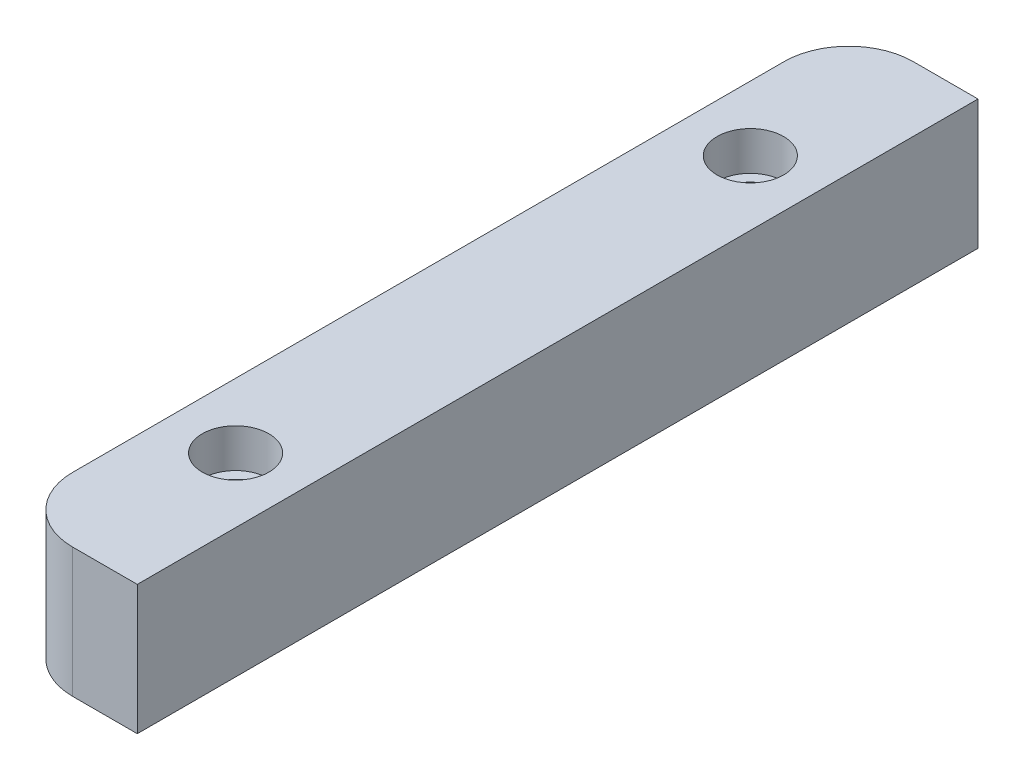
ISO-10303-21;
HEADER;
FILE_DESCRIPTION(('STEP AP214'),'2;1');
FILE_NAME('part.step','',(''),(''),'','','');
FILE_SCHEMA(('AUTOMOTIVE_DESIGN { 1 0 10303 214 1 1 1 1 }'));
ENDSEC;
DATA;
#1=APPLICATION_CONTEXT('core data for automotive mechanical design processes');
#2=APPLICATION_PROTOCOL_DEFINITION('international standard','automotive_design',2000,#1);
#3=PRODUCT_CONTEXT('',#1,'mechanical');
#4=PRODUCT('Part','Part','',(#3));
#5=PRODUCT_RELATED_PRODUCT_CATEGORY('part','',(#4));
#6=PRODUCT_DEFINITION_FORMATION('','',#4);
#7=PRODUCT_DEFINITION_CONTEXT('part definition',#1,'design');
#8=PRODUCT_DEFINITION('design','',#6,#7);
#9=PRODUCT_DEFINITION_SHAPE('','',#8);
#10=(LENGTH_UNIT() NAMED_UNIT(*) SI_UNIT(.MILLI.,.METRE.));
#11=(NAMED_UNIT(*) PLANE_ANGLE_UNIT() SI_UNIT($,.RADIAN.));
#12=(NAMED_UNIT(*) SI_UNIT($,.STERADIAN.) SOLID_ANGLE_UNIT());
#13=UNCERTAINTY_MEASURE_WITH_UNIT(LENGTH_MEASURE(1.E-05),#10,'distance_accuracy_value','');
#14=(GEOMETRIC_REPRESENTATION_CONTEXT(3) GLOBAL_UNCERTAINTY_ASSIGNED_CONTEXT((#13)) GLOBAL_UNIT_ASSIGNED_CONTEXT((#10,
#11,#12)) REPRESENTATION_CONTEXT('',''));
#15=CARTESIAN_POINT('',(0.,0.,0.));
#16=DIRECTION('',(0.,0.,1.));
#17=DIRECTION('',(1.,0.,0.));
#18=AXIS2_PLACEMENT_3D('',#15,#16,#17);
#19=CARTESIAN_POINT('',(0.,5.,0.));
#20=DIRECTION('',(0.,-1.,0.));
#21=DIRECTION('',(0.,0.,-1.));
#22=AXIS2_PLACEMENT_3D('',#19,#20,#21);
#23=PLANE('',#22);
#24=DIRECTION('',(-1.,0.,0.));
#25=VECTOR('',#24,1.);
#26=CARTESIAN_POINT('',(42.5,5.,32.5));
#27=LINE('',#26,#25);
#28=CARTESIAN_POINT('',(-32.5,5.,32.5));
#29=VERTEX_POINT('',#28);
#30=CARTESIAN_POINT('',(-37.5,5.,32.5));
#31=VERTEX_POINT('',#30);
#32=EDGE_CURVE('E64',#29,#31,#27,.T.);
#33=ORIENTED_EDGE('',*,*,#32,.T.);
#34=CARTESIAN_POINT('',(-37.5,5.,27.5));
#35=DIRECTION('',(0.,-1.,0.));
#36=DIRECTION('',(0.,0.,-1.));
#37=AXIS2_PLACEMENT_3D('',#34,#35,#36);
#38=CIRCLE('',#37,5.);
#39=CARTESIAN_POINT('',(-42.5,5.,27.5));
#40=VERTEX_POINT('',#39);
#41=EDGE_CURVE('E151',#40,#31,#38,.F.);
#42=ORIENTED_EDGE('',*,*,#41,.F.);
#43=DIRECTION('',(0.,0.,-1.));
#44=VECTOR('',#43,1.);
#45=CARTESIAN_POINT('',(-42.5,5.,-32.5));
#46=LINE('',#45,#44);
#47=CARTESIAN_POINT('',(-42.5,5.,-27.5));
#48=VERTEX_POINT('',#47);
#49=EDGE_CURVE('E155',#40,#48,#46,.T.);
#50=ORIENTED_EDGE('',*,*,#49,.T.);
#51=CARTESIAN_POINT('',(-37.5,5.,-27.5));
#52=DIRECTION('',(0.,-1.,0.));
#53=DIRECTION('',(0.,0.,-1.));
#54=AXIS2_PLACEMENT_3D('',#51,#52,#53);
#55=CIRCLE('',#54,5.);
#56=CARTESIAN_POINT('',(-37.5,5.,-32.5));
#57=VERTEX_POINT('',#56);
#58=EDGE_CURVE('E145',#57,#48,#55,.F.);
#59=ORIENTED_EDGE('',*,*,#58,.F.);
#60=DIRECTION('',(1.,0.,0.));
#61=VECTOR('',#60,1.);
#62=CARTESIAN_POINT('',(42.5,5.,-32.5));
#63=LINE('',#62,#61);
#64=CARTESIAN_POINT('',(-32.5,5.,-32.5));
#65=VERTEX_POINT('',#64);
#66=EDGE_CURVE('E143',#57,#65,#63,.T.);
#67=ORIENTED_EDGE('',*,*,#66,.T.);
#68=DIRECTION('',(0.,0.,-1.));
#69=VECTOR('',#68,1.);
#70=CARTESIAN_POINT('',(-32.5,5.,-32.5));
#71=LINE('',#70,#69);
#72=EDGE_CURVE('E172',#29,#65,#71,.T.);
#73=ORIENTED_EDGE('',*,*,#72,.F.);
#74=EDGE_LOOP('',(#33,#42,#50,#59,#67,#73));
#75=FACE_BOUND('',#74,.T.);
#76=CARTESIAN_POINT('',(-37.5,5.,-19.9));
#77=DIRECTION('',(0.,-1.,0.));
#78=DIRECTION('',(0.,0.,-1.));
#79=AXIS2_PLACEMENT_3D('',#76,#77,#78);
#80=CIRCLE('',#79,1.75);
#81=CARTESIAN_POINT('',(-37.5,5.,-21.65));
#82=VERTEX_POINT('',#81);
#83=EDGE_CURVE('E150',#82,#82,#80,.F.);
#84=ORIENTED_EDGE('',*,*,#83,.T.);
#85=EDGE_LOOP('',(#84));
#86=FACE_BOUND('',#85,.T.);
#87=CARTESIAN_POINT('',(-37.5,5.,19.9));
#88=DIRECTION('',(0.,-1.,0.));
#89=DIRECTION('',(0.,0.,-1.));
#90=AXIS2_PLACEMENT_3D('',#87,#88,#89);
#91=CIRCLE('',#90,1.75);
#92=CARTESIAN_POINT('',(-37.5,5.,18.15));
#93=VERTEX_POINT('',#92);
#94=EDGE_CURVE('E160',#93,#93,#91,.F.);
#95=ORIENTED_EDGE('',*,*,#94,.T.);
#96=EDGE_LOOP('',(#95));
#97=FACE_BOUND('',#96,.T.);
#98=DIRECTION('',(-1.,0.,0.));
#99=VECTOR('',#98,1.);
#100=CARTESIAN_POINT('',(-38.75,5.,7.25000000000001));
#101=LINE('',#100,#99);
#102=CARTESIAN_POINT('',(-36.25,5.,7.25000000000001));
#103=VERTEX_POINT('',#102);
#104=CARTESIAN_POINT('',(-38.75,5.,7.25000000000001));
#105=VERTEX_POINT('',#104);
#106=EDGE_CURVE('E402',#103,#105,#101,.T.);
#107=ORIENTED_EDGE('',*,*,#106,.F.);
#108=DIRECTION('',(0.,0.,1.));
#109=VECTOR('',#108,1.);
#110=CARTESIAN_POINT('',(-36.25,5.,-7.24999999999999));
#111=LINE('',#110,#109);
#112=CARTESIAN_POINT('',(-36.25,5.,-7.24999999999999));
#113=VERTEX_POINT('',#112);
#114=EDGE_CURVE('E141',#113,#103,#111,.T.);
#115=ORIENTED_EDGE('',*,*,#114,.F.);
#116=DIRECTION('',(1.,0.,0.));
#117=VECTOR('',#116,1.);
#118=CARTESIAN_POINT('',(-38.75,5.,-7.24999999999999));
#119=LINE('',#118,#117);
#120=CARTESIAN_POINT('',(-38.75,5.,-7.24999999999999));
#121=VERTEX_POINT('',#120);
#122=EDGE_CURVE('E137',#121,#113,#119,.T.);
#123=ORIENTED_EDGE('',*,*,#122,.F.);
#124=DIRECTION('',(0.,0.,-1.));
#125=VECTOR('',#124,1.);
#126=CARTESIAN_POINT('',(-38.75,5.,-7.24999999999999));
#127=LINE('',#126,#125);
#128=EDGE_CURVE('E399',#105,#121,#127,.T.);
#129=ORIENTED_EDGE('',*,*,#128,.F.);
#130=EDGE_LOOP('',(#107,#115,#123,#129));
#131=FACE_BOUND('',#130,.T.);
#132=ADVANCED_FACE('F41',(#75,#86,#97,#131),#23,.T.);
#133=CARTESIAN_POINT('',(-37.5,-28.6417402223123,19.9));
#134=DIRECTION('',(0.,1.,0.));
#135=DIRECTION('',(0.,0.,1.));
#136=AXIS2_PLACEMENT_3D('',#133,#134,#135);
#137=CYLINDRICAL_SURFACE('',#136,1.75);
#138=CARTESIAN_POINT('',(-37.5,12.,19.9));
#139=DIRECTION('',(0.,1.,0.));
#140=DIRECTION('',(0.,0.,1.));
#141=AXIS2_PLACEMENT_3D('',#138,#139,#140);
#142=CIRCLE('',#141,1.75);
#143=CARTESIAN_POINT('',(-37.5,12.,21.65));
#144=VERTEX_POINT('',#143);
#145=EDGE_CURVE('E168',#144,#144,#142,.T.);
#146=ORIENTED_EDGE('',*,*,#145,.T.);
#147=EDGE_LOOP('',(#146));
#148=FACE_BOUND('',#147,.T.);
#149=ORIENTED_EDGE('',*,*,#94,.F.);
#150=EDGE_LOOP('',(#149));
#151=FACE_BOUND('',#150,.T.);
#152=ADVANCED_FACE('F243',(#148,#151),#137,.F.);
#153=CARTESIAN_POINT('',(-37.5,-28.6417402223123,-19.9));
#154=DIRECTION('',(0.,1.,0.));
#155=DIRECTION('',(0.,0.,1.));
#156=AXIS2_PLACEMENT_3D('',#153,#154,#155);
#157=CYLINDRICAL_SURFACE('',#156,1.75);
#158=CARTESIAN_POINT('',(-37.5,12.,-19.9));
#159=DIRECTION('',(0.,1.,0.));
#160=DIRECTION('',(0.,0.,1.));
#161=AXIS2_PLACEMENT_3D('',#158,#159,#160);
#162=CIRCLE('',#161,1.75);
#163=CARTESIAN_POINT('',(-37.5,12.,-18.15));
#164=VERTEX_POINT('',#163);
#165=EDGE_CURVE('E164',#164,#164,#162,.T.);
#166=ORIENTED_EDGE('',*,*,#165,.T.);
#167=EDGE_LOOP('',(#166));
#168=FACE_BOUND('',#167,.T.);
#169=ORIENTED_EDGE('',*,*,#83,.F.);
#170=EDGE_LOOP('',(#169));
#171=FACE_BOUND('',#170,.T.);
#172=ADVANCED_FACE('F249',(#168,#171),#157,.F.);
#173=CARTESIAN_POINT('',(-42.5,5.,-32.5));
#174=DIRECTION('',(1.,0.,0.));
#175=DIRECTION('',(0.,0.,-1.));
#176=AXIS2_PLACEMENT_3D('',#173,#174,#175);
#177=PLANE('',#176);
#178=ORIENTED_EDGE('',*,*,#49,.F.);
#179=DIRECTION('',(0.,-1.,0.));
#180=VECTOR('',#179,1.);
#181=CARTESIAN_POINT('',(-42.5,5.,27.5));
#182=LINE('',#181,#180);
#183=CARTESIAN_POINT('',(-42.5,15.,27.5));
#184=VERTEX_POINT('',#183);
#185=EDGE_CURVE('E200',#40,#184,#182,.F.);
#186=ORIENTED_EDGE('',*,*,#185,.T.);
#187=DIRECTION('',(0.,0.,1.));
#188=VECTOR('',#187,1.);
#189=CARTESIAN_POINT('',(-42.5,15.,-32.5));
#190=LINE('',#189,#188);
#191=CARTESIAN_POINT('',(-42.5,15.,-27.5));
#192=VERTEX_POINT('',#191);
#193=EDGE_CURVE('E182',#192,#184,#190,.T.);
#194=ORIENTED_EDGE('',*,*,#193,.F.);
#195=DIRECTION('',(0.,-1.,0.));
#196=VECTOR('',#195,1.);
#197=CARTESIAN_POINT('',(-42.5,5.,-27.5));
#198=LINE('',#197,#196);
#199=EDGE_CURVE('E202',#192,#48,#198,.T.);
#200=ORIENTED_EDGE('',*,*,#199,.T.);
#201=EDGE_LOOP('',(#178,#186,#194,#200));
#202=FACE_BOUND('',#201,.T.);
#203=ADVANCED_FACE('F219',(#202),#177,.F.);
#204=CARTESIAN_POINT('',(42.5,5.,32.5));
#205=DIRECTION('',(0.,0.,-1.));
#206=DIRECTION('',(-1.,0.,0.));
#207=AXIS2_PLACEMENT_3D('',#204,#205,#206);
#208=PLANE('',#207);
#209=ORIENTED_EDGE('',*,*,#32,.F.);
#210=DIRECTION('',(0.,-1.,0.));
#211=VECTOR('',#210,1.);
#212=CARTESIAN_POINT('',(-32.5,15.,32.5));
#213=LINE('',#212,#211);
#214=CARTESIAN_POINT('',(-32.5,15.,32.5));
#215=VERTEX_POINT('',#214);
#216=EDGE_CURVE('E197',#215,#29,#213,.T.);
#217=ORIENTED_EDGE('',*,*,#216,.F.);
#218=DIRECTION('',(1.,0.,0.));
#219=VECTOR('',#218,1.);
#220=CARTESIAN_POINT('',(-42.5,15.,32.5));
#221=LINE('',#220,#219);
#222=CARTESIAN_POINT('',(-37.5,15.,32.5));
#223=VERTEX_POINT('',#222);
#224=EDGE_CURVE('E185',#223,#215,#221,.T.);
#225=ORIENTED_EDGE('',*,*,#224,.F.);
#226=DIRECTION('',(0.,-1.,0.));
#227=VECTOR('',#226,1.);
#228=CARTESIAN_POINT('',(-37.5,5.,32.5));
#229=LINE('',#228,#227);
#230=EDGE_CURVE('E11',#223,#31,#229,.T.);
#231=ORIENTED_EDGE('',*,*,#230,.T.);
#232=EDGE_LOOP('',(#209,#217,#225,#231));
#233=FACE_BOUND('',#232,.T.);
#234=ADVANCED_FACE('F232',(#233),#208,.F.);
#235=CARTESIAN_POINT('',(42.5,5.,-32.5));
#236=DIRECTION('',(0.,0.,1.));
#237=DIRECTION('',(1.,0.,0.));
#238=AXIS2_PLACEMENT_3D('',#235,#236,#237);
#239=PLANE('',#238);
#240=ORIENTED_EDGE('',*,*,#66,.F.);
#241=DIRECTION('',(0.,-1.,0.));
#242=VECTOR('',#241,1.);
#243=CARTESIAN_POINT('',(-37.5,5.,-32.5));
#244=LINE('',#243,#242);
#245=CARTESIAN_POINT('',(-37.5,15.,-32.5));
#246=VERTEX_POINT('',#245);
#247=EDGE_CURVE('E205',#57,#246,#244,.F.);
#248=ORIENTED_EDGE('',*,*,#247,.T.);
#249=DIRECTION('',(-1.,0.,0.));
#250=VECTOR('',#249,1.);
#251=CARTESIAN_POINT('',(-42.5,15.,-32.5));
#252=LINE('',#251,#250);
#253=CARTESIAN_POINT('',(-32.5,15.,-32.5));
#254=VERTEX_POINT('',#253);
#255=EDGE_CURVE('E189',#254,#246,#252,.T.);
#256=ORIENTED_EDGE('',*,*,#255,.F.);
#257=DIRECTION('',(0.,-1.,0.));
#258=VECTOR('',#257,1.);
#259=CARTESIAN_POINT('',(-32.5,15.,-32.5));
#260=LINE('',#259,#258);
#261=EDGE_CURVE('E192',#254,#65,#260,.T.);
#262=ORIENTED_EDGE('',*,*,#261,.T.);
#263=EDGE_LOOP('',(#240,#248,#256,#262));
#264=FACE_BOUND('',#263,.T.);
#265=ADVANCED_FACE('F225',(#264),#239,.F.);
#266=CARTESIAN_POINT('',(-37.5,5.,-27.5));
#267=DIRECTION('',(0.,-1.,0.));
#268=DIRECTION('',(0.,0.,-1.));
#269=AXIS2_PLACEMENT_3D('',#266,#267,#268);
#270=CYLINDRICAL_SURFACE('',#269,5.);
#271=ORIENTED_EDGE('',*,*,#247,.F.);
#272=ORIENTED_EDGE('',*,*,#58,.T.);
#273=ORIENTED_EDGE('',*,*,#199,.F.);
#274=CARTESIAN_POINT('',(-37.5,15.,-27.5));
#275=DIRECTION('',(0.,1.,0.));
#276=DIRECTION('',(0.,0.,1.));
#277=AXIS2_PLACEMENT_3D('',#274,#275,#276);
#278=CIRCLE('',#277,5.);
#279=EDGE_CURVE('E49',#246,#192,#278,.T.);
#280=ORIENTED_EDGE('',*,*,#279,.F.);
#281=EDGE_LOOP('',(#271,#272,#273,#280));
#282=FACE_BOUND('',#281,.T.);
#283=ADVANCED_FACE('F221',(#282),#270,.T.);
#284=CARTESIAN_POINT('',(-37.5,5.,27.5));
#285=DIRECTION('',(0.,-1.,0.));
#286=DIRECTION('',(0.,0.,-1.));
#287=AXIS2_PLACEMENT_3D('',#284,#285,#286);
#288=CYLINDRICAL_SURFACE('',#287,5.);
#289=ORIENTED_EDGE('',*,*,#185,.F.);
#290=ORIENTED_EDGE('',*,*,#41,.T.);
#291=ORIENTED_EDGE('',*,*,#230,.F.);
#292=CARTESIAN_POINT('',(-37.5,15.,27.5));
#293=DIRECTION('',(0.,1.,0.));
#294=DIRECTION('',(0.,0.,1.));
#295=AXIS2_PLACEMENT_3D('',#292,#293,#294);
#296=CIRCLE('',#295,5.);
#297=EDGE_CURVE('E207',#184,#223,#296,.T.);
#298=ORIENTED_EDGE('',*,*,#297,.F.);
#299=EDGE_LOOP('',(#289,#290,#291,#298));
#300=FACE_BOUND('',#299,.T.);
#301=ADVANCED_FACE('F43',(#300),#288,.T.);
#302=CARTESIAN_POINT('',(-32.5,15.,-32.5));
#303=DIRECTION('',(-1.,0.,0.));
#304=DIRECTION('',(0.,0.,1.));
#305=AXIS2_PLACEMENT_3D('',#302,#303,#304);
#306=PLANE('',#305);
#307=ORIENTED_EDGE('',*,*,#72,.T.);
#308=ORIENTED_EDGE('',*,*,#261,.F.);
#309=DIRECTION('',(0.,0.,-1.));
#310=VECTOR('',#309,1.);
#311=CARTESIAN_POINT('',(-32.5,15.,-32.5));
#312=LINE('',#311,#310);
#313=EDGE_CURVE('E187',#215,#254,#312,.T.);
#314=ORIENTED_EDGE('',*,*,#313,.F.);
#315=ORIENTED_EDGE('',*,*,#216,.T.);
#316=EDGE_LOOP('',(#307,#308,#314,#315));
#317=FACE_BOUND('',#316,.T.);
#318=ADVANCED_FACE('F229',(#317),#306,.F.);
#319=CARTESIAN_POINT('',(0.,15.,0.));
#320=DIRECTION('',(0.,1.,0.));
#321=DIRECTION('',(0.,0.,1.));
#322=AXIS2_PLACEMENT_3D('',#319,#320,#321);
#323=PLANE('',#322);
#324=CARTESIAN_POINT('',(-37.5,15.,-19.9));
#325=DIRECTION('',(0.,1.,0.));
#326=DIRECTION('',(0.,0.,1.));
#327=AXIS2_PLACEMENT_3D('',#324,#325,#326);
#328=CIRCLE('',#327,2.575);
#329=CARTESIAN_POINT('',(-37.5,15.,-17.325));
#330=VERTEX_POINT('',#329);
#331=EDGE_CURVE('E167',#330,#330,#328,.T.);
#332=ORIENTED_EDGE('',*,*,#331,.F.);
#333=EDGE_LOOP('',(#332));
#334=FACE_BOUND('',#333,.T.);
#335=CARTESIAN_POINT('',(-37.5,15.,19.9));
#336=DIRECTION('',(0.,1.,0.));
#337=DIRECTION('',(0.,0.,1.));
#338=AXIS2_PLACEMENT_3D('',#335,#336,#337);
#339=CIRCLE('',#338,2.575);
#340=CARTESIAN_POINT('',(-37.5,15.,22.475));
#341=VERTEX_POINT('',#340);
#342=EDGE_CURVE('E175',#341,#341,#339,.T.);
#343=ORIENTED_EDGE('',*,*,#342,.F.);
#344=EDGE_LOOP('',(#343));
#345=FACE_BOUND('',#344,.T.);
#346=ORIENTED_EDGE('',*,*,#255,.T.);
#347=ORIENTED_EDGE('',*,*,#279,.T.);
#348=ORIENTED_EDGE('',*,*,#193,.T.);
#349=ORIENTED_EDGE('',*,*,#297,.T.);
#350=ORIENTED_EDGE('',*,*,#224,.T.);
#351=ORIENTED_EDGE('',*,*,#313,.T.);
#352=EDGE_LOOP('',(#346,#347,#348,#349,#350,#351));
#353=FACE_BOUND('',#352,.T.);
#354=ADVANCED_FACE('F211',(#334,#345,#353),#323,.T.);
#355=CARTESIAN_POINT('',(-37.5,12.,-19.9));
#356=DIRECTION('',(0.,1.,0.));
#357=DIRECTION('',(0.,0.,1.));
#358=AXIS2_PLACEMENT_3D('',#355,#356,#357);
#359=CYLINDRICAL_SURFACE('',#358,2.575);
#360=CARTESIAN_POINT('',(-37.5,12.,-19.9));
#361=DIRECTION('',(0.,1.,0.));
#362=DIRECTION('',(0.,0.,1.));
#363=AXIS2_PLACEMENT_3D('',#360,#361,#362);
#364=CIRCLE('',#363,2.575);
#365=CARTESIAN_POINT('',(-37.5,12.,-17.325));
#366=VERTEX_POINT('',#365);
#367=EDGE_CURVE('E169',#366,#366,#364,.T.);
#368=ORIENTED_EDGE('',*,*,#367,.F.);
#369=EDGE_LOOP('',(#368));
#370=FACE_BOUND('',#369,.T.);
#371=ORIENTED_EDGE('',*,*,#331,.T.);
#372=EDGE_LOOP('',(#371));
#373=FACE_BOUND('',#372,.T.);
#374=ADVANCED_FACE('F259',(#370,#373),#359,.F.);
#375=CARTESIAN_POINT('',(-37.5,12.,-19.9));
#376=DIRECTION('',(0.,1.,0.));
#377=DIRECTION('',(0.,0.,1.));
#378=AXIS2_PLACEMENT_3D('',#375,#376,#377);
#379=PLANE('',#378);
#380=ORIENTED_EDGE('',*,*,#165,.F.);
#381=EDGE_LOOP('',(#380));
#382=FACE_BOUND('',#381,.T.);
#383=ORIENTED_EDGE('',*,*,#367,.T.);
#384=EDGE_LOOP('',(#383));
#385=FACE_BOUND('',#384,.T.);
#386=ADVANCED_FACE('F255',(#382,#385),#379,.T.);
#387=CARTESIAN_POINT('',(-37.5,12.,19.9));
#388=DIRECTION('',(0.,1.,0.));
#389=DIRECTION('',(0.,0.,1.));
#390=AXIS2_PLACEMENT_3D('',#387,#388,#389);
#391=CYLINDRICAL_SURFACE('',#390,2.575);
#392=CARTESIAN_POINT('',(-37.5,12.,19.9));
#393=DIRECTION('',(0.,1.,0.));
#394=DIRECTION('',(0.,0.,1.));
#395=AXIS2_PLACEMENT_3D('',#392,#393,#394);
#396=CIRCLE('',#395,2.575);
#397=CARTESIAN_POINT('',(-37.5,12.,22.475));
#398=VERTEX_POINT('',#397);
#399=EDGE_CURVE('E163',#398,#398,#396,.T.);
#400=ORIENTED_EDGE('',*,*,#399,.F.);
#401=EDGE_LOOP('',(#400));
#402=FACE_BOUND('',#401,.T.);
#403=ORIENTED_EDGE('',*,*,#342,.T.);
#404=EDGE_LOOP('',(#403));
#405=FACE_BOUND('',#404,.T.);
#406=ADVANCED_FACE('F258',(#402,#405),#391,.F.);
#407=CARTESIAN_POINT('',(-37.5,12.,19.9));
#408=DIRECTION('',(0.,1.,0.));
#409=DIRECTION('',(0.,0.,1.));
#410=AXIS2_PLACEMENT_3D('',#407,#408,#409);
#411=PLANE('',#410);
#412=ORIENTED_EDGE('',*,*,#145,.F.);
#413=EDGE_LOOP('',(#412));
#414=FACE_BOUND('',#413,.T.);
#415=ORIENTED_EDGE('',*,*,#399,.T.);
#416=EDGE_LOOP('',(#415));
#417=FACE_BOUND('',#416,.T.);
#418=ADVANCED_FACE('F266',(#414,#417),#411,.T.);
#419=CARTESIAN_POINT('',(-36.25,2.2,-7.24999999999999));
#420=DIRECTION('',(-1.,0.,0.));
#421=DIRECTION('',(0.,0.,1.));
#422=AXIS2_PLACEMENT_3D('',#419,#420,#421);
#423=PLANE('',#422);
#424=ORIENTED_EDGE('',*,*,#114,.T.);
#425=DIRECTION('',(0.,1.,0.));
#426=VECTOR('',#425,1.);
#427=CARTESIAN_POINT('',(-36.25,2.2,7.25000000000001));
#428=LINE('',#427,#426);
#429=CARTESIAN_POINT('',(-36.25,2.2,7.25000000000001));
#430=VERTEX_POINT('',#429);
#431=EDGE_CURVE('E122',#430,#103,#428,.T.);
#432=ORIENTED_EDGE('',*,*,#431,.F.);
#433=DIRECTION('',(0.,0.,1.));
#434=VECTOR('',#433,1.);
#435=CARTESIAN_POINT('',(-36.25,2.2,-7.24999999999999));
#436=LINE('',#435,#434);
#437=CARTESIAN_POINT('',(-36.25,2.2,-7.24999999999999));
#438=VERTEX_POINT('',#437);
#439=EDGE_CURVE('E129',#438,#430,#436,.T.);
#440=ORIENTED_EDGE('',*,*,#439,.F.);
#441=DIRECTION('',(0.,1.,0.));
#442=VECTOR('',#441,1.);
#443=CARTESIAN_POINT('',(-36.25,2.2,-7.24999999999999));
#444=LINE('',#443,#442);
#445=EDGE_CURVE('E396',#438,#113,#444,.T.);
#446=ORIENTED_EDGE('',*,*,#445,.T.);
#447=EDGE_LOOP('',(#424,#432,#440,#446));
#448=FACE_BOUND('',#447,.T.);
#449=ADVANCED_FACE('F139',(#448),#423,.F.);
#450=CARTESIAN_POINT('',(-38.75,2.2,7.25000000000001));
#451=DIRECTION('',(0.,0.,-1.));
#452=DIRECTION('',(-1.,0.,0.));
#453=AXIS2_PLACEMENT_3D('',#450,#451,#452);
#454=PLANE('',#453);
#455=ORIENTED_EDGE('',*,*,#106,.T.);
#456=DIRECTION('',(0.,1.,0.));
#457=VECTOR('',#456,1.);
#458=CARTESIAN_POINT('',(-38.75,2.2,7.25000000000001));
#459=LINE('',#458,#457);
#460=CARTESIAN_POINT('',(-38.75,2.2,7.25000000000001));
#461=VERTEX_POINT('',#460);
#462=EDGE_CURVE('E125',#461,#105,#459,.T.);
#463=ORIENTED_EDGE('',*,*,#462,.F.);
#464=DIRECTION('',(-1.,0.,0.));
#465=VECTOR('',#464,1.);
#466=CARTESIAN_POINT('',(-38.75,2.2,7.25000000000001));
#467=LINE('',#466,#465);
#468=EDGE_CURVE('E118',#430,#461,#467,.T.);
#469=ORIENTED_EDGE('',*,*,#468,.F.);
#470=ORIENTED_EDGE('',*,*,#431,.T.);
#471=EDGE_LOOP('',(#455,#463,#469,#470));
#472=FACE_BOUND('',#471,.T.);
#473=ADVANCED_FACE('F120',(#472),#454,.F.);
#474=CARTESIAN_POINT('',(-38.75,2.2,-7.24999999999999));
#475=DIRECTION('',(1.,0.,0.));
#476=DIRECTION('',(0.,0.,-1.));
#477=AXIS2_PLACEMENT_3D('',#474,#475,#476);
#478=PLANE('',#477);
#479=ORIENTED_EDGE('',*,*,#128,.T.);
#480=DIRECTION('',(0.,1.,0.));
#481=VECTOR('',#480,1.);
#482=CARTESIAN_POINT('',(-38.75,2.2,-7.24999999999999));
#483=LINE('',#482,#481);
#484=CARTESIAN_POINT('',(-38.75,2.2,-7.24999999999999));
#485=VERTEX_POINT('',#484);
#486=EDGE_CURVE('E56',#485,#121,#483,.T.);
#487=ORIENTED_EDGE('',*,*,#486,.F.);
#488=DIRECTION('',(0.,0.,-1.));
#489=VECTOR('',#488,1.);
#490=CARTESIAN_POINT('',(-38.75,2.2,-7.24999999999999));
#491=LINE('',#490,#489);
#492=EDGE_CURVE('E128',#461,#485,#491,.T.);
#493=ORIENTED_EDGE('',*,*,#492,.F.);
#494=ORIENTED_EDGE('',*,*,#462,.T.);
#495=EDGE_LOOP('',(#479,#487,#493,#494));
#496=FACE_BOUND('',#495,.T.);
#497=ADVANCED_FACE('F365',(#496),#478,.F.);
#498=CARTESIAN_POINT('',(-38.75,2.2,-7.24999999999999));
#499=DIRECTION('',(0.,0.,1.));
#500=DIRECTION('',(1.,0.,0.));
#501=AXIS2_PLACEMENT_3D('',#498,#499,#500);
#502=PLANE('',#501);
#503=ORIENTED_EDGE('',*,*,#122,.T.);
#504=ORIENTED_EDGE('',*,*,#445,.F.);
#505=DIRECTION('',(1.,0.,0.));
#506=VECTOR('',#505,1.);
#507=CARTESIAN_POINT('',(-38.75,2.2,-7.24999999999999));
#508=LINE('',#507,#506);
#509=EDGE_CURVE('E133',#485,#438,#508,.T.);
#510=ORIENTED_EDGE('',*,*,#509,.F.);
#511=ORIENTED_EDGE('',*,*,#486,.T.);
#512=EDGE_LOOP('',(#503,#504,#510,#511));
#513=FACE_BOUND('',#512,.T.);
#514=ADVANCED_FACE('F372',(#513),#502,.F.);
#515=CARTESIAN_POINT('',(0.,2.2,0.));
#516=DIRECTION('',(0.,1.,0.));
#517=DIRECTION('',(0.,0.,1.));
#518=AXIS2_PLACEMENT_3D('',#515,#516,#517);
#519=PLANE('',#518);
#520=ORIENTED_EDGE('',*,*,#439,.T.);
#521=ORIENTED_EDGE('',*,*,#468,.T.);
#522=ORIENTED_EDGE('',*,*,#492,.T.);
#523=ORIENTED_EDGE('',*,*,#509,.T.);
#524=EDGE_LOOP('',(#520,#521,#522,#523));
#525=FACE_BOUND('',#524,.T.);
#526=ADVANCED_FACE('F132',(#525),#519,.F.);
#527=CLOSED_SHELL('',(#132,#152,#172,#203,#234,#265,#283,#301,#318,#354,#374,#386,#406,#418,
#449,#473,#497,#514,#526));
#528=MANIFOLD_SOLID_BREP('B2',#527);
#529=ADVANCED_BREP_SHAPE_REPRESENTATION('',(#18,#528),#14);
#530=SHAPE_DEFINITION_REPRESENTATION(#9,#529);
ENDSEC;
END-ISO-10303-21;
